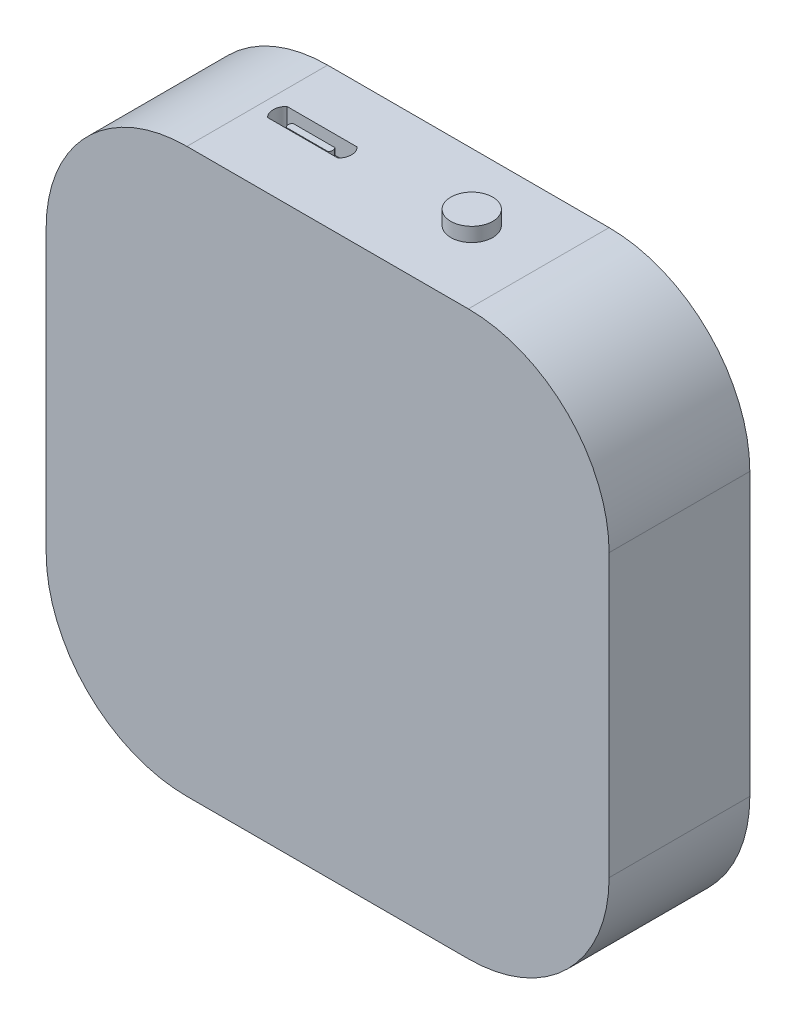
ISO-10303-21;
HEADER;
FILE_DESCRIPTION(('STEP AP214'),'2;1');
FILE_NAME('part.step','',(''),(''),'','','');
FILE_SCHEMA(('AUTOMOTIVE_DESIGN { 1 0 10303 214 1 1 1 1 }'));
ENDSEC;
DATA;
#1=APPLICATION_CONTEXT('core data for automotive mechanical design processes');
#2=APPLICATION_PROTOCOL_DEFINITION('international standard','automotive_design',2000,#1);
#3=PRODUCT_CONTEXT('',#1,'mechanical');
#4=PRODUCT('Part','Part','',(#3));
#5=PRODUCT_RELATED_PRODUCT_CATEGORY('part','',(#4));
#6=PRODUCT_DEFINITION_FORMATION('','',#4);
#7=PRODUCT_DEFINITION_CONTEXT('part definition',#1,'design');
#8=PRODUCT_DEFINITION('design','',#6,#7);
#9=PRODUCT_DEFINITION_SHAPE('','',#8);
#10=(LENGTH_UNIT() NAMED_UNIT(*) SI_UNIT(.MILLI.,.METRE.));
#11=(NAMED_UNIT(*) PLANE_ANGLE_UNIT() SI_UNIT($,.RADIAN.));
#12=(NAMED_UNIT(*) SI_UNIT($,.STERADIAN.) SOLID_ANGLE_UNIT());
#13=UNCERTAINTY_MEASURE_WITH_UNIT(LENGTH_MEASURE(1.E-05),#10,'distance_accuracy_value','');
#14=(GEOMETRIC_REPRESENTATION_CONTEXT(3) GLOBAL_UNCERTAINTY_ASSIGNED_CONTEXT((#13)) GLOBAL_UNIT_ASSIGNED_CONTEXT((#10,
#11,#12)) REPRESENTATION_CONTEXT('',''));
#15=CARTESIAN_POINT('',(0.,0.,0.));
#16=DIRECTION('',(0.,0.,1.));
#17=DIRECTION('',(1.,0.,0.));
#18=AXIS2_PLACEMENT_3D('',#15,#16,#17);
#19=CARTESIAN_POINT('',(3.98835760158891,10.3346153846154,-5.32735397519315));
#20=DIRECTION('',(0.,1.,0.));
#21=DIRECTION('',(0.,0.,1.));
#22=AXIS2_PLACEMENT_3D('',#19,#20,#21);
#23=PLANE('',#22);
#24=CARTESIAN_POINT('',(3.98835760158891,10.3346153846154,-5.32735397519315));
#25=DIRECTION('',(0.,1.,0.));
#26=DIRECTION('',(0.,0.,1.));
#27=AXIS2_PLACEMENT_3D('',#24,#25,#26);
#28=CIRCLE('',#27,0.969111158165627);
#29=CARTESIAN_POINT('',(3.30309252992644,10.3346153846154,-6.01261904685561));
#30=VERTEX_POINT('',#29);
#31=CARTESIAN_POINT('',(3.30309252992644,10.3346153846154,-4.64208890353068));
#32=VERTEX_POINT('',#31);
#33=EDGE_CURVE('E191',#30,#32,#28,.T.);
#34=ORIENTED_EDGE('',*,*,#33,.T.);
#35=DIRECTION('',(1.,0.,0.));
#36=VECTOR('',#35,1.);
#37=CARTESIAN_POINT('',(3.30309252992644,10.3346153846154,-4.64208890353068));
#38=LINE('',#37,#36);
#39=CARTESIAN_POINT('',(8.29889595559474,10.3346153846154,-4.64208890353068));
#40=VERTEX_POINT('',#39);
#41=EDGE_CURVE('E194',#32,#40,#38,.T.);
#42=ORIENTED_EDGE('',*,*,#41,.T.);
#43=CARTESIAN_POINT('',(7.61363088393227,10.3346153846154,-5.32735397519315));
#44=DIRECTION('',(0.,1.,0.));
#45=DIRECTION('',(0.,0.,-1.));
#46=AXIS2_PLACEMENT_3D('',#43,#44,#45);
#47=CIRCLE('',#46,0.969111158165626);
#48=CARTESIAN_POINT('',(8.29889595559474,10.3346153846154,-6.01261904685561));
#49=VERTEX_POINT('',#48);
#50=EDGE_CURVE('E198',#40,#49,#47,.T.);
#51=ORIENTED_EDGE('',*,*,#50,.T.);
#52=DIRECTION('',(-1.,0.,0.));
#53=VECTOR('',#52,1.);
#54=CARTESIAN_POINT('',(3.30309252992644,10.3346153846154,-6.01261904685561));
#55=LINE('',#54,#53);
#56=EDGE_CURVE('E201',#49,#30,#55,.T.);
#57=ORIENTED_EDGE('',*,*,#56,.T.);
#58=EDGE_LOOP('',(#34,#42,#51,#57));
#59=FACE_BOUND('',#58,.T.);
#60=DIRECTION('',(1.,0.,0.));
#61=VECTOR('',#60,1.);
#62=CARTESIAN_POINT('',(4.2757268251893,10.3346153846154,-4.99577410180808));
#63=LINE('',#62,#61);
#64=CARTESIAN_POINT('',(4.2757268251893,10.3346153846154,-4.99577410180808));
#65=VERTEX_POINT('',#64);
#66=CARTESIAN_POINT('',(7.23784036076253,10.3346153846154,-4.99577410180808));
#67=VERTEX_POINT('',#66);
#68=EDGE_CURVE('E659',#65,#67,#63,.T.);
#69=ORIENTED_EDGE('',*,*,#68,.F.);
#70=CARTESIAN_POINT('',(4.51888539900501,10.3346153846154,-5.23893267562379));
#71=DIRECTION('',(0.,1.,0.));
#72=DIRECTION('',(0.,0.,-1.));
#73=AXIS2_PLACEMENT_3D('',#70,#71,#72);
#74=CIRCLE('',#73,0.34387815289748);
#75=CARTESIAN_POINT('',(4.2757268251893,10.3346153846154,-5.4820912494395));
#76=VERTEX_POINT('',#75);
#77=EDGE_CURVE('E183',#76,#65,#74,.T.);
#78=ORIENTED_EDGE('',*,*,#77,.F.);
#79=DIRECTION('',(-1.,0.,0.));
#80=VECTOR('',#79,1.);
#81=CARTESIAN_POINT('',(4.2757268251893,10.3346153846154,-5.4820912494395));
#82=LINE('',#81,#80);
#83=CARTESIAN_POINT('',(7.23784036076253,10.3346153846154,-5.4820912494395));
#84=VERTEX_POINT('',#83);
#85=EDGE_CURVE('E179',#84,#76,#82,.T.);
#86=ORIENTED_EDGE('',*,*,#85,.F.);
#87=CARTESIAN_POINT('',(6.99468178694682,10.3346153846154,-5.23893267562379));
#88=DIRECTION('',(0.,1.,0.));
#89=DIRECTION('',(0.,0.,-1.));
#90=AXIS2_PLACEMENT_3D('',#87,#88,#89);
#91=CIRCLE('',#90,0.343878152897479);
#92=EDGE_CURVE('E657',#67,#84,#91,.T.);
#93=ORIENTED_EDGE('',*,*,#92,.F.);
#94=EDGE_LOOP('',(#69,#78,#86,#93));
#95=FACE_BOUND('',#94,.T.);
#96=ADVANCED_FACE('F42',(#59,#95),#23,.T.);
#97=CARTESIAN_POINT('',(22.2115384615385,-18.3653846153846,-10.));
#98=DIRECTION('',(0.,0.,-1.));
#99=DIRECTION('',(-1.,0.,0.));
#100=AXIS2_PLACEMENT_3D('',#97,#98,#99);
#101=CYLINDRICAL_SURFACE('',#100,10.);
#102=DIRECTION('',(0.,0.,-1.));
#103=VECTOR('',#102,1.);
#104=CARTESIAN_POINT('',(32.2115384615385,-18.3653846153846,-10.));
#105=LINE('',#104,#103);
#106=CARTESIAN_POINT('',(32.2115384615385,-18.3653846153846,0.));
#107=VERTEX_POINT('',#106);
#108=CARTESIAN_POINT('',(32.2115384615385,-18.3653846153846,-10.));
#109=VERTEX_POINT('',#108);
#110=EDGE_CURVE('E292',#107,#109,#105,.T.);
#111=ORIENTED_EDGE('',*,*,#110,.F.);
#112=CARTESIAN_POINT('',(22.2115384615385,-18.3653846153846,0.));
#113=DIRECTION('',(0.,0.,1.));
#114=DIRECTION('',(1.,0.,0.));
#115=AXIS2_PLACEMENT_3D('',#112,#113,#114);
#116=CIRCLE('',#115,10.);
#117=CARTESIAN_POINT('',(22.2115384615385,-28.3653846153846,0.));
#118=VERTEX_POINT('',#117);
#119=EDGE_CURVE('E50',#118,#107,#116,.T.);
#120=ORIENTED_EDGE('',*,*,#119,.F.);
#121=DIRECTION('',(0.,0.,-1.));
#122=VECTOR('',#121,1.);
#123=CARTESIAN_POINT('',(22.2115384615385,-28.3653846153846,-10.));
#124=LINE('',#123,#122);
#125=CARTESIAN_POINT('',(22.2115384615385,-28.3653846153846,-10.));
#126=VERTEX_POINT('',#125);
#127=EDGE_CURVE('E295',#126,#118,#124,.F.);
#128=ORIENTED_EDGE('',*,*,#127,.F.);
#129=CARTESIAN_POINT('',(22.2115384615385,-18.3653846153846,-10.));
#130=DIRECTION('',(0.,0.,1.));
#131=DIRECTION('',(1.,0.,0.));
#132=AXIS2_PLACEMENT_3D('',#129,#130,#131);
#133=CIRCLE('',#132,10.);
#134=EDGE_CURVE('E11',#109,#126,#133,.F.);
#135=ORIENTED_EDGE('',*,*,#134,.F.);
#136=EDGE_LOOP('',(#111,#120,#128,#135));
#137=FACE_BOUND('',#136,.T.);
#138=ADVANCED_FACE('F44',(#137),#101,.T.);
#139=CARTESIAN_POINT('',(2.21153846153849,-18.3653846153846,-10.));
#140=DIRECTION('',(0.,0.,1.));
#141=DIRECTION('',(1.,0.,0.));
#142=AXIS2_PLACEMENT_3D('',#139,#140,#141);
#143=CYLINDRICAL_SURFACE('',#142,10.);
#144=DIRECTION('',(0.,0.,1.));
#145=VECTOR('',#144,1.);
#146=CARTESIAN_POINT('',(-7.78846153846151,-18.3653846153846,-10.));
#147=LINE('',#146,#145);
#148=CARTESIAN_POINT('',(-7.78846153846151,-18.3653846153846,-10.));
#149=VERTEX_POINT('',#148);
#150=CARTESIAN_POINT('',(-7.78846153846151,-18.3653846153846,0.));
#151=VERTEX_POINT('',#150);
#152=EDGE_CURVE('E280',#149,#151,#147,.T.);
#153=ORIENTED_EDGE('',*,*,#152,.F.);
#154=CARTESIAN_POINT('',(2.21153846153849,-18.3653846153846,-10.));
#155=DIRECTION('',(0.,0.,1.));
#156=DIRECTION('',(1.,0.,0.));
#157=AXIS2_PLACEMENT_3D('',#154,#155,#156);
#158=CIRCLE('',#157,10.);
#159=CARTESIAN_POINT('',(2.21153846153849,-28.3653846153846,-10.));
#160=VERTEX_POINT('',#159);
#161=EDGE_CURVE('E288',#160,#149,#158,.F.);
#162=ORIENTED_EDGE('',*,*,#161,.F.);
#163=DIRECTION('',(0.,0.,1.));
#164=VECTOR('',#163,1.);
#165=CARTESIAN_POINT('',(2.21153846153849,-28.3653846153846,-10.));
#166=LINE('',#165,#164);
#167=CARTESIAN_POINT('',(2.21153846153849,-28.3653846153846,0.));
#168=VERTEX_POINT('',#167);
#169=EDGE_CURVE('E285',#168,#160,#166,.F.);
#170=ORIENTED_EDGE('',*,*,#169,.F.);
#171=CARTESIAN_POINT('',(2.21153846153849,-18.3653846153846,0.));
#172=DIRECTION('',(0.,0.,1.));
#173=DIRECTION('',(1.,0.,0.));
#174=AXIS2_PLACEMENT_3D('',#171,#172,#173);
#175=CIRCLE('',#174,10.);
#176=EDGE_CURVE('E290',#151,#168,#175,.T.);
#177=ORIENTED_EDGE('',*,*,#176,.F.);
#178=EDGE_LOOP('',(#153,#162,#170,#177));
#179=FACE_BOUND('',#178,.T.);
#180=ADVANCED_FACE('F327',(#179),#143,.T.);
#181=CARTESIAN_POINT('',(2.21153846153849,1.63461538461538,-10.));
#182=DIRECTION('',(0.,0.,1.));
#183=DIRECTION('',(1.,0.,0.));
#184=AXIS2_PLACEMENT_3D('',#181,#182,#183);
#185=CYLINDRICAL_SURFACE('',#184,10.);
#186=DIRECTION('',(0.,0.,1.));
#187=VECTOR('',#186,1.);
#188=CARTESIAN_POINT('',(2.21153846153849,11.6346153846154,-10.));
#189=LINE('',#188,#187);
#190=CARTESIAN_POINT('',(2.21153846153849,11.6346153846154,-10.));
#191=VERTEX_POINT('',#190);
#192=CARTESIAN_POINT('',(2.21153846153849,11.6346153846154,0.));
#193=VERTEX_POINT('',#192);
#194=EDGE_CURVE('E268',#191,#193,#189,.T.);
#195=ORIENTED_EDGE('',*,*,#194,.F.);
#196=CARTESIAN_POINT('',(2.21153846153849,1.63461538461538,-10.));
#197=DIRECTION('',(0.,0.,1.));
#198=DIRECTION('',(1.,0.,0.));
#199=AXIS2_PLACEMENT_3D('',#196,#197,#198);
#200=CIRCLE('',#199,10.);
#201=CARTESIAN_POINT('',(-7.78846153846151,1.63461538461538,-10.));
#202=VERTEX_POINT('',#201);
#203=EDGE_CURVE('E274',#202,#191,#200,.F.);
#204=ORIENTED_EDGE('',*,*,#203,.F.);
#205=DIRECTION('',(0.,0.,1.));
#206=VECTOR('',#205,1.);
#207=CARTESIAN_POINT('',(-7.78846153846151,1.63461538461538,-10.));
#208=LINE('',#207,#206);
#209=CARTESIAN_POINT('',(-7.78846153846151,1.63461538461538,0.));
#210=VERTEX_POINT('',#209);
#211=EDGE_CURVE('E271',#210,#202,#208,.F.);
#212=ORIENTED_EDGE('',*,*,#211,.F.);
#213=CARTESIAN_POINT('',(2.21153846153849,1.63461538461538,0.));
#214=DIRECTION('',(0.,0.,1.));
#215=DIRECTION('',(1.,0.,0.));
#216=AXIS2_PLACEMENT_3D('',#213,#214,#215);
#217=CIRCLE('',#216,10.);
#218=CARTESIAN_POINT('',(-6.24377605725037,6.97387154894748,0.));
#219=VERTEX_POINT('',#218);
#220=EDGE_CURVE('E276',#219,#210,#217,.T.);
#221=ORIENTED_EDGE('',*,*,#220,.F.);
#222=CARTESIAN_POINT('',(2.21153846153849,1.63461538461538,0.));
#223=DIRECTION('',(0.,0.,1.));
#224=DIRECTION('',(1.,0.,0.));
#225=AXIS2_PLACEMENT_3D('',#222,#223,#224);
#226=CIRCLE('',#225,10.);
#227=CARTESIAN_POINT('',(-3.28697012693114,9.98724391116472,0.));
#228=VERTEX_POINT('',#227);
#229=EDGE_CURVE('E214',#219,#228,#226,.F.);
#230=ORIENTED_EDGE('',*,*,#229,.T.);
#231=CARTESIAN_POINT('',(2.21153846153849,1.63461538461538,0.));
#232=DIRECTION('',(0.,0.,1.));
#233=DIRECTION('',(1.,0.,0.));
#234=AXIS2_PLACEMENT_3D('',#231,#232,#233);
#235=CIRCLE('',#234,10.);
#236=EDGE_CURVE('E278',#193,#228,#235,.T.);
#237=ORIENTED_EDGE('',*,*,#236,.F.);
#238=EDGE_LOOP('',(#195,#204,#212,#221,#230,#237));
#239=FACE_BOUND('',#238,.T.);
#240=ADVANCED_FACE('F319',(#239),#185,.T.);
#241=CARTESIAN_POINT('',(22.2115384615385,1.63461538461538,-10.));
#242=DIRECTION('',(0.,0.,-1.));
#243=DIRECTION('',(-1.,0.,0.));
#244=AXIS2_PLACEMENT_3D('',#241,#242,#243);
#245=CYLINDRICAL_SURFACE('',#244,10.);
#246=DIRECTION('',(0.,0.,-1.));
#247=VECTOR('',#246,1.);
#248=CARTESIAN_POINT('',(22.2115384615385,11.6346153846154,-10.));
#249=LINE('',#248,#247);
#250=CARTESIAN_POINT('',(22.2115384615385,11.6346153846154,0.));
#251=VERTEX_POINT('',#250);
#252=CARTESIAN_POINT('',(22.2115384615385,11.6346153846154,-10.));
#253=VERTEX_POINT('',#252);
#254=EDGE_CURVE('E257',#251,#253,#249,.T.);
#255=ORIENTED_EDGE('',*,*,#254,.F.);
#256=CARTESIAN_POINT('',(22.2115384615385,1.63461538461538,0.));
#257=DIRECTION('',(0.,0.,1.));
#258=DIRECTION('',(1.,0.,0.));
#259=AXIS2_PLACEMENT_3D('',#256,#257,#258);
#260=CIRCLE('',#259,10.);
#261=CARTESIAN_POINT('',(32.2115384615385,1.63461538461538,0.));
#262=VERTEX_POINT('',#261);
#263=EDGE_CURVE('E263',#262,#251,#260,.T.);
#264=ORIENTED_EDGE('',*,*,#263,.F.);
#265=DIRECTION('',(0.,0.,-1.));
#266=VECTOR('',#265,1.);
#267=CARTESIAN_POINT('',(32.2115384615385,1.63461538461538,-10.));
#268=LINE('',#267,#266);
#269=CARTESIAN_POINT('',(32.2115384615385,1.63461538461538,-10.));
#270=VERTEX_POINT('',#269);
#271=EDGE_CURVE('E260',#270,#262,#268,.F.);
#272=ORIENTED_EDGE('',*,*,#271,.F.);
#273=CARTESIAN_POINT('',(22.2115384615385,1.63461538461538,-10.));
#274=DIRECTION('',(0.,0.,1.));
#275=DIRECTION('',(1.,0.,0.));
#276=AXIS2_PLACEMENT_3D('',#273,#274,#275);
#277=CIRCLE('',#276,10.);
#278=EDGE_CURVE('E265',#253,#270,#277,.F.);
#279=ORIENTED_EDGE('',*,*,#278,.F.);
#280=EDGE_LOOP('',(#255,#264,#272,#279));
#281=FACE_BOUND('',#280,.T.);
#282=ADVANCED_FACE('F311',(#281),#245,.T.);
#283=CARTESIAN_POINT('',(-7.78846153846152,11.6346153846154,-10.));
#284=DIRECTION('',(-1.,0.,0.));
#285=DIRECTION('',(0.,-1.,0.));
#286=AXIS2_PLACEMENT_3D('',#283,#284,#285);
#287=PLANE('',#286);
#288=DIRECTION('',(0.,-1.,0.));
#289=VECTOR('',#288,1.);
#290=CARTESIAN_POINT('',(-7.78846153846152,11.6346153846154,-10.));
#291=LINE('',#290,#289);
#292=EDGE_CURVE('E232',#202,#149,#291,.T.);
#293=ORIENTED_EDGE('',*,*,#292,.T.);
#294=ORIENTED_EDGE('',*,*,#152,.T.);
#295=DIRECTION('',(0.,-1.,0.));
#296=VECTOR('',#295,1.);
#297=CARTESIAN_POINT('',(-7.78846153846152,11.6346153846154,0.));
#298=LINE('',#297,#296);
#299=EDGE_CURVE('E223',#210,#151,#298,.T.);
#300=ORIENTED_EDGE('',*,*,#299,.F.);
#301=ORIENTED_EDGE('',*,*,#211,.T.);
#302=EDGE_LOOP('',(#293,#294,#300,#301));
#303=FACE_BOUND('',#302,.T.);
#304=ADVANCED_FACE('F324',(#303),#287,.T.);
#305=CARTESIAN_POINT('',(-7.78846153846152,11.6346153846154,-10.));
#306=DIRECTION('',(0.,1.,0.));
#307=DIRECTION('',(0.,0.,1.));
#308=AXIS2_PLACEMENT_3D('',#305,#306,#307);
#309=PLANE('',#308);
#310=CARTESIAN_POINT('',(17.1987091765573,11.6346153846154,-5.25375548160372));
#311=DIRECTION('',(0.,1.,0.));
#312=DIRECTION('',(0.,0.,1.));
#313=AXIS2_PLACEMENT_3D('',#310,#311,#312);
#314=CIRCLE('',#313,1.49076908591832);
#315=CARTESIAN_POINT('',(17.1987091765573,11.6346153846154,-3.7629863956854));
#316=VERTEX_POINT('',#315);
#317=EDGE_CURVE('E670',#316,#316,#314,.T.);
#318=ORIENTED_EDGE('',*,*,#317,.F.);
#319=EDGE_LOOP('',(#318));
#320=FACE_BOUND('',#319,.T.);
#321=CARTESIAN_POINT('',(3.98835760158891,11.6346153846154,-5.32735397519315));
#322=DIRECTION('',(0.,1.,0.));
#323=DIRECTION('',(0.,0.,1.));
#324=AXIS2_PLACEMENT_3D('',#321,#322,#323);
#325=CIRCLE('',#324,0.969111158165627);
#326=CARTESIAN_POINT('',(3.30309252992644,11.6346153846154,-6.01261904685561));
#327=VERTEX_POINT('',#326);
#328=CARTESIAN_POINT('',(3.30309252992644,11.6346153846154,-4.64208890353068));
#329=VERTEX_POINT('',#328);
#330=EDGE_CURVE('E65',#327,#329,#325,.T.);
#331=ORIENTED_EDGE('',*,*,#330,.F.);
#332=DIRECTION('',(-1.,0.,0.));
#333=VECTOR('',#332,1.);
#334=CARTESIAN_POINT('',(3.30309252992644,11.6346153846154,-6.01261904685561));
#335=LINE('',#334,#333);
#336=CARTESIAN_POINT('',(8.29889595559474,11.6346153846154,-6.01261904685561));
#337=VERTEX_POINT('',#336);
#338=EDGE_CURVE('E195',#337,#327,#335,.T.);
#339=ORIENTED_EDGE('',*,*,#338,.F.);
#340=CARTESIAN_POINT('',(7.61363088393227,11.6346153846154,-5.32735397519315));
#341=DIRECTION('',(0.,1.,0.));
#342=DIRECTION('',(0.,0.,-1.));
#343=AXIS2_PLACEMENT_3D('',#340,#341,#342);
#344=CIRCLE('',#343,0.969111158165626);
#345=CARTESIAN_POINT('',(8.29889595559474,11.6346153846154,-4.64208890353068));
#346=VERTEX_POINT('',#345);
#347=EDGE_CURVE('E207',#346,#337,#344,.T.);
#348=ORIENTED_EDGE('',*,*,#347,.F.);
#349=DIRECTION('',(1.,0.,0.));
#350=VECTOR('',#349,1.);
#351=CARTESIAN_POINT('',(3.30309252992644,11.6346153846154,-4.64208890353068));
#352=LINE('',#351,#350);
#353=EDGE_CURVE('E186',#329,#346,#352,.T.);
#354=ORIENTED_EDGE('',*,*,#353,.F.);
#355=EDGE_LOOP('',(#331,#339,#348,#354));
#356=FACE_BOUND('',#355,.T.);
#357=DIRECTION('',(-1.,0.,0.));
#358=VECTOR('',#357,1.);
#359=CARTESIAN_POINT('',(-7.78846153846152,11.6346153846154,-10.));
#360=LINE('',#359,#358);
#361=EDGE_CURVE('E231',#253,#191,#360,.T.);
#362=ORIENTED_EDGE('',*,*,#361,.T.);
#363=ORIENTED_EDGE('',*,*,#194,.T.);
#364=DIRECTION('',(-1.,0.,0.));
#365=VECTOR('',#364,1.);
#366=CARTESIAN_POINT('',(-7.78846153846152,11.6346153846154,0.));
#367=LINE('',#366,#365);
#368=EDGE_CURVE('E236',#251,#193,#367,.T.);
#369=ORIENTED_EDGE('',*,*,#368,.F.);
#370=ORIENTED_EDGE('',*,*,#254,.T.);
#371=EDGE_LOOP('',(#362,#363,#369,#370));
#372=FACE_BOUND('',#371,.T.);
#373=ADVANCED_FACE('F315',(#320,#356,#372),#309,.T.);
#374=CARTESIAN_POINT('',(32.2115384615385,11.6346153846154,-10.));
#375=DIRECTION('',(1.,0.,0.));
#376=DIRECTION('',(0.,0.,-1.));
#377=AXIS2_PLACEMENT_3D('',#374,#375,#376);
#378=PLANE('',#377);
#379=DIRECTION('',(0.,1.,0.));
#380=VECTOR('',#379,1.);
#381=CARTESIAN_POINT('',(32.2115384615385,11.6346153846154,0.));
#382=LINE('',#381,#380);
#383=EDGE_CURVE('E248',#107,#262,#382,.T.);
#384=ORIENTED_EDGE('',*,*,#383,.F.);
#385=ORIENTED_EDGE('',*,*,#110,.T.);
#386=DIRECTION('',(0.,1.,0.));
#387=VECTOR('',#386,1.);
#388=CARTESIAN_POINT('',(32.2115384615385,11.6346153846154,-10.));
#389=LINE('',#388,#387);
#390=EDGE_CURVE('E239',#109,#270,#389,.T.);
#391=ORIENTED_EDGE('',*,*,#390,.T.);
#392=ORIENTED_EDGE('',*,*,#271,.T.);
#393=EDGE_LOOP('',(#384,#385,#391,#392));
#394=FACE_BOUND('',#393,.T.);
#395=ADVANCED_FACE('F307',(#394),#378,.T.);
#396=CARTESIAN_POINT('',(-7.78846153846151,-28.3653846153846,-10.));
#397=DIRECTION('',(0.,-1.,0.));
#398=DIRECTION('',(1.,0.,0.));
#399=AXIS2_PLACEMENT_3D('',#396,#397,#398);
#400=PLANE('',#399);
#401=DIRECTION('',(1.,0.,0.));
#402=VECTOR('',#401,1.);
#403=CARTESIAN_POINT('',(-7.78846153846151,-28.3653846153846,-10.));
#404=LINE('',#403,#402);
#405=EDGE_CURVE('E235',#160,#126,#404,.T.);
#406=ORIENTED_EDGE('',*,*,#405,.T.);
#407=ORIENTED_EDGE('',*,*,#127,.T.);
#408=DIRECTION('',(1.,0.,0.));
#409=VECTOR('',#408,1.);
#410=CARTESIAN_POINT('',(-7.78846153846151,-28.3653846153846,0.));
#411=LINE('',#410,#409);
#412=EDGE_CURVE('E245',#168,#118,#411,.T.);
#413=ORIENTED_EDGE('',*,*,#412,.F.);
#414=ORIENTED_EDGE('',*,*,#169,.T.);
#415=EDGE_LOOP('',(#406,#407,#413,#414));
#416=FACE_BOUND('',#415,.T.);
#417=ADVANCED_FACE('F331',(#416),#400,.T.);
#418=CARTESIAN_POINT('',(0.,0.,-10.));
#419=DIRECTION('',(0.,0.,1.));
#420=DIRECTION('',(1.,0.,0.));
#421=AXIS2_PLACEMENT_3D('',#418,#419,#420);
#422=PLANE('',#421);
#423=CARTESIAN_POINT('',(12.2115384615385,-8.36538461538462,-10.));
#424=DIRECTION('',(0.,0.,-1.));
#425=DIRECTION('',(-1.,0.,0.));
#426=AXIS2_PLACEMENT_3D('',#423,#424,#425);
#427=CIRCLE('',#426,12.5);
#428=CARTESIAN_POINT('',(-0.288461538461515,-8.36538461538462,-10.));
#429=VERTEX_POINT('',#428);
#430=EDGE_CURVE('E227',#429,#429,#427,.T.);
#431=ORIENTED_EDGE('',*,*,#430,.F.);
#432=EDGE_LOOP('',(#431));
#433=FACE_BOUND('',#432,.T.);
#434=ORIENTED_EDGE('',*,*,#390,.F.);
#435=ORIENTED_EDGE('',*,*,#134,.T.);
#436=ORIENTED_EDGE('',*,*,#405,.F.);
#437=ORIENTED_EDGE('',*,*,#161,.T.);
#438=ORIENTED_EDGE('',*,*,#292,.F.);
#439=ORIENTED_EDGE('',*,*,#203,.T.);
#440=ORIENTED_EDGE('',*,*,#361,.F.);
#441=ORIENTED_EDGE('',*,*,#278,.T.);
#442=EDGE_LOOP('',(#434,#435,#436,#437,#438,#439,#440,#441));
#443=FACE_BOUND('',#442,.T.);
#444=ADVANCED_FACE('F333',(#433,#443),#422,.F.);
#445=CARTESIAN_POINT('',(0.,0.,0.));
#446=DIRECTION('',(0.,0.,1.));
#447=DIRECTION('',(1.,0.,0.));
#448=AXIS2_PLACEMENT_3D('',#445,#446,#447);
#449=PLANE('',#448);
#450=ORIENTED_EDGE('',*,*,#412,.T.);
#451=ORIENTED_EDGE('',*,*,#119,.T.);
#452=ORIENTED_EDGE('',*,*,#383,.T.);
#453=ORIENTED_EDGE('',*,*,#263,.T.);
#454=ORIENTED_EDGE('',*,*,#368,.T.);
#455=ORIENTED_EDGE('',*,*,#236,.T.);
#456=ORIENTED_EDGE('',*,*,#229,.F.);
#457=ORIENTED_EDGE('',*,*,#220,.T.);
#458=ORIENTED_EDGE('',*,*,#299,.T.);
#459=ORIENTED_EDGE('',*,*,#176,.T.);
#460=EDGE_LOOP('',(#450,#451,#452,#453,#454,#455,#456,#457,#458,#459));
#461=FACE_BOUND('',#460,.T.);
#462=ADVANCED_FACE('F299',(#461),#449,.T.);
#463=CARTESIAN_POINT('',(12.2115384615385,-8.36538461538462,-21.));
#464=DIRECTION('',(0.,0.,1.));
#465=DIRECTION('',(1.,0.,0.));
#466=AXIS2_PLACEMENT_3D('',#463,#464,#465);
#467=CYLINDRICAL_SURFACE('',#466,12.5);
#468=CARTESIAN_POINT('',(12.2115384615385,-8.36538461538462,-17.));
#469=DIRECTION('',(0.,0.,-1.));
#470=DIRECTION('',(-1.,0.,0.));
#471=AXIS2_PLACEMENT_3D('',#468,#469,#470);
#472=CIRCLE('',#471,12.5);
#473=CARTESIAN_POINT('',(-0.288461538461515,-8.36538461538462,-17.));
#474=VERTEX_POINT('',#473);
#475=EDGE_CURVE('E254',#474,#474,#472,.F.);
#476=ORIENTED_EDGE('',*,*,#475,.T.);
#477=EDGE_LOOP('',(#476));
#478=FACE_BOUND('',#477,.T.);
#479=ORIENTED_EDGE('',*,*,#430,.T.);
#480=EDGE_LOOP('',(#479));
#481=FACE_BOUND('',#480,.T.);
#482=ADVANCED_FACE('F341',(#478,#481),#467,.T.);
#483=CARTESIAN_POINT('',(12.2115384615385,-8.36538461538462,-21.));
#484=DIRECTION('',(0.,0.,-1.));
#485=DIRECTION('',(-1.,0.,0.));
#486=AXIS2_PLACEMENT_3D('',#483,#484,#485);
#487=PLANE('',#486);
#488=CARTESIAN_POINT('',(12.1267722128187,-8.56317252906399,-21.));
#489=DIRECTION('',(0.,0.,-1.));
#490=DIRECTION('',(-1.,0.,0.));
#491=AXIS2_PLACEMENT_3D('',#488,#489,#490);
#492=CIRCLE('',#491,4.);
#493=CARTESIAN_POINT('',(8.12677221281871,-8.56317252906399,-21.));
#494=VERTEX_POINT('',#493);
#495=EDGE_CURVE('E224',#494,#494,#492,.T.);
#496=ORIENTED_EDGE('',*,*,#495,.F.);
#497=EDGE_LOOP('',(#496));
#498=FACE_BOUND('',#497,.T.);
#499=CARTESIAN_POINT('',(12.2115384615385,-8.36538461538462,-21.));
#500=DIRECTION('',(0.,0.,-1.));
#501=DIRECTION('',(-1.,0.,0.));
#502=AXIS2_PLACEMENT_3D('',#499,#500,#501);
#503=CIRCLE('',#502,8.50000000000001);
#504=CARTESIAN_POINT('',(3.71153846153847,-8.36538461538462,-21.));
#505=VERTEX_POINT('',#504);
#506=EDGE_CURVE('E230',#505,#505,#503,.T.);
#507=ORIENTED_EDGE('',*,*,#506,.T.);
#508=EDGE_LOOP('',(#507));
#509=FACE_BOUND('',#508,.T.);
#510=ADVANCED_FACE('F380',(#498,#509),#487,.T.);
#511=CARTESIAN_POINT('',(12.2115384615385,-8.36538461538462,-21.));
#512=DIRECTION('',(0.,0.,1.));
#513=DIRECTION('',(1.,0.,0.));
#514=AXIS2_PLACEMENT_3D('',#511,#512,#513);
#515=CONICAL_SURFACE('',#514,8.50000000000001,0.785398163397447);
#516=ORIENTED_EDGE('',*,*,#475,.F.);
#517=EDGE_LOOP('',(#516));
#518=FACE_BOUND('',#517,.T.);
#519=ORIENTED_EDGE('',*,*,#506,.F.);
#520=EDGE_LOOP('',(#519));
#521=FACE_BOUND('',#520,.T.);
#522=ADVANCED_FACE('F378',(#518,#521),#515,.T.);
#523=CARTESIAN_POINT('',(12.1267722128187,-8.56317252906399,-20.));
#524=DIRECTION('',(0.,0.,-1.));
#525=DIRECTION('',(-1.,0.,0.));
#526=AXIS2_PLACEMENT_3D('',#523,#524,#525);
#527=CYLINDRICAL_SURFACE('',#526,4.);
#528=CARTESIAN_POINT('',(12.1267722128187,-8.56317252906399,-20.));
#529=DIRECTION('',(0.,0.,-1.));
#530=DIRECTION('',(-1.,0.,0.));
#531=AXIS2_PLACEMENT_3D('',#528,#529,#530);
#532=CIRCLE('',#531,4.);
#533=CARTESIAN_POINT('',(8.12677221281871,-8.56317252906399,-20.));
#534=VERTEX_POINT('',#533);
#535=EDGE_CURVE('E220',#534,#534,#532,.T.);
#536=ORIENTED_EDGE('',*,*,#535,.F.);
#537=EDGE_LOOP('',(#536));
#538=FACE_BOUND('',#537,.T.);
#539=ORIENTED_EDGE('',*,*,#495,.T.);
#540=EDGE_LOOP('',(#539));
#541=FACE_BOUND('',#540,.T.);
#542=ADVANCED_FACE('F374',(#538,#541),#527,.F.);
#543=CARTESIAN_POINT('',(12.1267722128187,-8.56317252906399,-20.));
#544=DIRECTION('',(0.,0.,-1.));
#545=DIRECTION('',(-1.,0.,0.));
#546=AXIS2_PLACEMENT_3D('',#543,#544,#545);
#547=PLANE('',#546);
#548=CARTESIAN_POINT('',(12.1267722128187,-8.56317252906399,-20.));
#549=DIRECTION('',(0.,0.,-1.));
#550=DIRECTION('',(-1.,0.,0.));
#551=AXIS2_PLACEMENT_3D('',#548,#549,#550);
#552=CIRCLE('',#551,1.31848668776102);
#553=CARTESIAN_POINT('',(10.8082855250577,-8.56317252906399,-20.));
#554=VERTEX_POINT('',#553);
#555=EDGE_CURVE('E677',#554,#554,#552,.T.);
#556=ORIENTED_EDGE('',*,*,#555,.F.);
#557=EDGE_LOOP('',(#556));
#558=FACE_BOUND('',#557,.T.);
#559=ORIENTED_EDGE('',*,*,#535,.T.);
#560=EDGE_LOOP('',(#559));
#561=FACE_BOUND('',#560,.T.);
#562=ADVANCED_FACE('F371',(#558,#561),#547,.T.);
#563=CARTESIAN_POINT('',(3.98835760158891,10.3346153846154,-5.32735397519315));
#564=DIRECTION('',(0.,1.,0.));
#565=DIRECTION('',(0.,0.,1.));
#566=AXIS2_PLACEMENT_3D('',#563,#564,#565);
#567=CYLINDRICAL_SURFACE('',#566,0.969111158165627);
#568=ORIENTED_EDGE('',*,*,#330,.T.);
#569=DIRECTION('',(0.,1.,0.));
#570=VECTOR('',#569,1.);
#571=CARTESIAN_POINT('',(3.30309252992644,10.3346153846154,-4.64208890353068));
#572=LINE('',#571,#570);
#573=EDGE_CURVE('E203',#32,#329,#572,.T.);
#574=ORIENTED_EDGE('',*,*,#573,.F.);
#575=ORIENTED_EDGE('',*,*,#33,.F.);
#576=DIRECTION('',(0.,1.,0.));
#577=VECTOR('',#576,1.);
#578=CARTESIAN_POINT('',(3.30309252992644,10.3346153846154,-6.01261904685561));
#579=LINE('',#578,#577);
#580=EDGE_CURVE('E212',#30,#327,#579,.T.);
#581=ORIENTED_EDGE('',*,*,#580,.T.);
#582=EDGE_LOOP('',(#568,#574,#575,#581));
#583=FACE_BOUND('',#582,.T.);
#584=ADVANCED_FACE('F360',(#583),#567,.F.);
#585=CARTESIAN_POINT('',(3.30309252992644,10.3346153846154,-6.01261904685561));
#586=DIRECTION('',(0.,0.,-1.));
#587=DIRECTION('',(-1.,0.,0.));
#588=AXIS2_PLACEMENT_3D('',#585,#586,#587);
#589=PLANE('',#588);
#590=ORIENTED_EDGE('',*,*,#338,.T.);
#591=ORIENTED_EDGE('',*,*,#580,.F.);
#592=ORIENTED_EDGE('',*,*,#56,.F.);
#593=DIRECTION('',(0.,1.,0.));
#594=VECTOR('',#593,1.);
#595=CARTESIAN_POINT('',(8.29889595559474,10.3346153846154,-6.01261904685561));
#596=LINE('',#595,#594);
#597=EDGE_CURVE('E215',#49,#337,#596,.T.);
#598=ORIENTED_EDGE('',*,*,#597,.T.);
#599=EDGE_LOOP('',(#590,#591,#592,#598));
#600=FACE_BOUND('',#599,.T.);
#601=ADVANCED_FACE('F356',(#600),#589,.F.);
#602=CARTESIAN_POINT('',(7.61363088393227,10.3346153846154,-5.32735397519315));
#603=DIRECTION('',(0.,1.,0.));
#604=DIRECTION('',(0.,0.,1.));
#605=AXIS2_PLACEMENT_3D('',#602,#603,#604);
#606=CYLINDRICAL_SURFACE('',#605,0.969111158165626);
#607=ORIENTED_EDGE('',*,*,#347,.T.);
#608=ORIENTED_EDGE('',*,*,#597,.F.);
#609=ORIENTED_EDGE('',*,*,#50,.F.);
#610=DIRECTION('',(0.,1.,0.));
#611=VECTOR('',#610,1.);
#612=CARTESIAN_POINT('',(8.29889595559474,10.3346153846154,-4.64208890353068));
#613=LINE('',#612,#611);
#614=EDGE_CURVE('E217',#40,#346,#613,.T.);
#615=ORIENTED_EDGE('',*,*,#614,.T.);
#616=EDGE_LOOP('',(#607,#608,#609,#615));
#617=FACE_BOUND('',#616,.T.);
#618=ADVANCED_FACE('F359',(#617),#606,.F.);
#619=CARTESIAN_POINT('',(3.30309252992644,10.3346153846154,-4.64208890353068));
#620=DIRECTION('',(0.,0.,1.));
#621=DIRECTION('',(1.,0.,0.));
#622=AXIS2_PLACEMENT_3D('',#619,#620,#621);
#623=PLANE('',#622);
#624=ORIENTED_EDGE('',*,*,#353,.T.);
#625=ORIENTED_EDGE('',*,*,#614,.F.);
#626=ORIENTED_EDGE('',*,*,#41,.F.);
#627=ORIENTED_EDGE('',*,*,#573,.T.);
#628=EDGE_LOOP('',(#624,#625,#626,#627));
#629=FACE_BOUND('',#628,.T.);
#630=ADVANCED_FACE('F364',(#629),#623,.F.);
#631=CARTESIAN_POINT('',(4.51888539900501,11.3346153846154,-5.23893267562379));
#632=DIRECTION('',(0.,-1.,0.));
#633=DIRECTION('',(0.,0.,-1.));
#634=AXIS2_PLACEMENT_3D('',#631,#632,#633);
#635=CYLINDRICAL_SURFACE('',#634,0.34387815289748);
#636=ORIENTED_EDGE('',*,*,#77,.T.);
#637=DIRECTION('',(0.,-1.,0.));
#638=VECTOR('',#637,1.);
#639=CARTESIAN_POINT('',(4.2757268251893,11.3346153846154,-4.99577410180808));
#640=LINE('',#639,#638);
#641=CARTESIAN_POINT('',(4.2757268251893,11.3346153846154,-4.99577410180808));
#642=VERTEX_POINT('',#641);
#643=EDGE_CURVE('E164',#642,#65,#640,.T.);
#644=ORIENTED_EDGE('',*,*,#643,.F.);
#645=CARTESIAN_POINT('',(4.51888539900501,11.3346153846154,-5.23893267562379));
#646=DIRECTION('',(0.,1.,0.));
#647=DIRECTION('',(0.,0.,-1.));
#648=AXIS2_PLACEMENT_3D('',#645,#646,#647);
#649=CIRCLE('',#648,0.34387815289748);
#650=CARTESIAN_POINT('',(4.2757268251893,11.3346153846154,-5.4820912494395));
#651=VERTEX_POINT('',#650);
#652=EDGE_CURVE('E171',#651,#642,#649,.T.);
#653=ORIENTED_EDGE('',*,*,#652,.F.);
#654=DIRECTION('',(0.,-1.,0.));
#655=VECTOR('',#654,1.);
#656=CARTESIAN_POINT('',(4.2757268251893,11.3346153846154,-5.4820912494395));
#657=LINE('',#656,#655);
#658=EDGE_CURVE('E664',#651,#76,#657,.T.);
#659=ORIENTED_EDGE('',*,*,#658,.T.);
#660=EDGE_LOOP('',(#636,#644,#653,#659));
#661=FACE_BOUND('',#660,.T.);
#662=ADVANCED_FACE('F181',(#661),#635,.T.);
#663=CARTESIAN_POINT('',(4.2757268251893,11.3346153846154,-4.99577410180808));
#664=DIRECTION('',(0.,0.,-1.));
#665=DIRECTION('',(-1.,0.,0.));
#666=AXIS2_PLACEMENT_3D('',#663,#664,#665);
#667=PLANE('',#666);
#668=ORIENTED_EDGE('',*,*,#68,.T.);
#669=DIRECTION('',(0.,-1.,0.));
#670=VECTOR('',#669,1.);
#671=CARTESIAN_POINT('',(7.23784036076253,11.3346153846154,-4.99577410180808));
#672=LINE('',#671,#670);
#673=CARTESIAN_POINT('',(7.23784036076253,11.3346153846154,-4.99577410180808));
#674=VERTEX_POINT('',#673);
#675=EDGE_CURVE('E167',#674,#67,#672,.T.);
#676=ORIENTED_EDGE('',*,*,#675,.F.);
#677=DIRECTION('',(1.,0.,0.));
#678=VECTOR('',#677,1.);
#679=CARTESIAN_POINT('',(4.2757268251893,11.3346153846154,-4.99577410180808));
#680=LINE('',#679,#678);
#681=EDGE_CURVE('E160',#642,#674,#680,.T.);
#682=ORIENTED_EDGE('',*,*,#681,.F.);
#683=ORIENTED_EDGE('',*,*,#643,.T.);
#684=EDGE_LOOP('',(#668,#676,#682,#683));
#685=FACE_BOUND('',#684,.T.);
#686=ADVANCED_FACE('F162',(#685),#667,.F.);
#687=CARTESIAN_POINT('',(6.99468178694682,11.3346153846154,-5.23893267562379));
#688=DIRECTION('',(0.,-1.,0.));
#689=DIRECTION('',(0.,0.,-1.));
#690=AXIS2_PLACEMENT_3D('',#687,#688,#689);
#691=CYLINDRICAL_SURFACE('',#690,0.343878152897479);
#692=ORIENTED_EDGE('',*,*,#92,.T.);
#693=DIRECTION('',(0.,-1.,0.));
#694=VECTOR('',#693,1.);
#695=CARTESIAN_POINT('',(7.23784036076253,11.3346153846154,-5.4820912494395));
#696=LINE('',#695,#694);
#697=CARTESIAN_POINT('',(7.23784036076253,11.3346153846154,-5.4820912494395));
#698=VERTEX_POINT('',#697);
#699=EDGE_CURVE('E57',#698,#84,#696,.T.);
#700=ORIENTED_EDGE('',*,*,#699,.F.);
#701=CARTESIAN_POINT('',(6.99468178694682,11.3346153846154,-5.23893267562379));
#702=DIRECTION('',(0.,1.,0.));
#703=DIRECTION('',(0.,0.,-1.));
#704=AXIS2_PLACEMENT_3D('',#701,#702,#703);
#705=CIRCLE('',#704,0.343878152897479);
#706=EDGE_CURVE('E170',#674,#698,#705,.T.);
#707=ORIENTED_EDGE('',*,*,#706,.F.);
#708=ORIENTED_EDGE('',*,*,#675,.T.);
#709=EDGE_LOOP('',(#692,#700,#707,#708));
#710=FACE_BOUND('',#709,.T.);
#711=ADVANCED_FACE('F567',(#710),#691,.T.);
#712=CARTESIAN_POINT('',(4.2757268251893,11.3346153846154,-5.4820912494395));
#713=DIRECTION('',(0.,0.,1.));
#714=DIRECTION('',(1.,0.,0.));
#715=AXIS2_PLACEMENT_3D('',#712,#713,#714);
#716=PLANE('',#715);
#717=ORIENTED_EDGE('',*,*,#85,.T.);
#718=ORIENTED_EDGE('',*,*,#658,.F.);
#719=DIRECTION('',(-1.,0.,0.));
#720=VECTOR('',#719,1.);
#721=CARTESIAN_POINT('',(4.2757268251893,11.3346153846154,-5.4820912494395));
#722=LINE('',#721,#720);
#723=EDGE_CURVE('E175',#698,#651,#722,.T.);
#724=ORIENTED_EDGE('',*,*,#723,.F.);
#725=ORIENTED_EDGE('',*,*,#699,.T.);
#726=EDGE_LOOP('',(#717,#718,#724,#725));
#727=FACE_BOUND('',#726,.T.);
#728=ADVANCED_FACE('F559',(#727),#716,.F.);
#729=CARTESIAN_POINT('',(4.51888539900501,11.3346153846154,-5.23893267562379));
#730=DIRECTION('',(0.,-1.,0.));
#731=DIRECTION('',(0.,0.,-1.));
#732=AXIS2_PLACEMENT_3D('',#729,#730,#731);
#733=PLANE('',#732);
#734=ORIENTED_EDGE('',*,*,#652,.T.);
#735=ORIENTED_EDGE('',*,*,#681,.T.);
#736=ORIENTED_EDGE('',*,*,#706,.T.);
#737=ORIENTED_EDGE('',*,*,#723,.T.);
#738=EDGE_LOOP('',(#734,#735,#736,#737));
#739=FACE_BOUND('',#738,.T.);
#740=ADVANCED_FACE('F174',(#739),#733,.F.);
#741=CARTESIAN_POINT('',(17.1987091765573,12.6346153846154,-5.25375548160372));
#742=DIRECTION('',(0.,-1.,0.));
#743=DIRECTION('',(0.,0.,-1.));
#744=AXIS2_PLACEMENT_3D('',#741,#742,#743);
#745=CYLINDRICAL_SURFACE('',#744,1.49076908591832);
#746=CARTESIAN_POINT('',(17.1987091765573,12.6346153846154,-5.25375548160372));
#747=DIRECTION('',(0.,1.,0.));
#748=DIRECTION('',(0.,0.,1.));
#749=AXIS2_PLACEMENT_3D('',#746,#747,#748);
#750=CIRCLE('',#749,1.49076908591832);
#751=CARTESIAN_POINT('',(17.1987091765573,12.6346153846154,-3.7629863956854));
#752=VERTEX_POINT('',#751);
#753=EDGE_CURVE('E668',#752,#752,#750,.T.);
#754=ORIENTED_EDGE('',*,*,#753,.F.);
#755=EDGE_LOOP('',(#754));
#756=FACE_BOUND('',#755,.T.);
#757=ORIENTED_EDGE('',*,*,#317,.T.);
#758=EDGE_LOOP('',(#757));
#759=FACE_BOUND('',#758,.T.);
#760=ADVANCED_FACE('F546',(#756,#759),#745,.T.);
#761=CARTESIAN_POINT('',(17.1987091765573,12.6346153846154,-5.25375548160372));
#762=DIRECTION('',(0.,1.,0.));
#763=DIRECTION('',(0.,0.,1.));
#764=AXIS2_PLACEMENT_3D('',#761,#762,#763);
#765=PLANE('',#764);
#766=ORIENTED_EDGE('',*,*,#753,.T.);
#767=EDGE_LOOP('',(#766));
#768=FACE_BOUND('',#767,.T.);
#769=ADVANCED_FACE('F517',(#768),#765,.T.);
#770=CARTESIAN_POINT('',(12.1267722128187,-8.56317252906399,-19.));
#771=DIRECTION('',(0.,0.,-1.));
#772=DIRECTION('',(-1.,0.,0.));
#773=AXIS2_PLACEMENT_3D('',#770,#771,#772);
#774=CYLINDRICAL_SURFACE('',#773,1.31848668776102);
#775=CARTESIAN_POINT('',(12.1267722128187,-8.56317252906399,-19.));
#776=DIRECTION('',(0.,0.,-1.));
#777=DIRECTION('',(-1.,0.,0.));
#778=AXIS2_PLACEMENT_3D('',#775,#776,#777);
#779=CIRCLE('',#778,1.31848668776102);
#780=CARTESIAN_POINT('',(10.8082855250577,-8.56317252906399,-19.));
#781=VERTEX_POINT('',#780);
#782=EDGE_CURVE('E674',#781,#781,#779,.T.);
#783=ORIENTED_EDGE('',*,*,#782,.F.);
#784=EDGE_LOOP('',(#783));
#785=FACE_BOUND('',#784,.T.);
#786=ORIENTED_EDGE('',*,*,#555,.T.);
#787=EDGE_LOOP('',(#786));
#788=FACE_BOUND('',#787,.T.);
#789=ADVANCED_FACE('F522',(#785,#788),#774,.F.);
#790=CARTESIAN_POINT('',(12.1267722128187,-8.56317252906399,-19.));
#791=DIRECTION('',(0.,0.,-1.));
#792=DIRECTION('',(-1.,0.,0.));
#793=AXIS2_PLACEMENT_3D('',#790,#791,#792);
#794=PLANE('',#793);
#795=ORIENTED_EDGE('',*,*,#782,.T.);
#796=EDGE_LOOP('',(#795));
#797=FACE_BOUND('',#796,.T.);
#798=ADVANCED_FACE('F527',(#797),#794,.T.);
#799=CLOSED_SHELL('',(#96,#138,#180,#240,#282,#304,#373,#395,#417,#444,#462,#482,#510,#522,#542,
#562,#584,#601,#618,#630,#662,#686,#711,#728,#740,#760,#769,#789,#798));
#800=MANIFOLD_SOLID_BREP('B2',#799);
#801=ADVANCED_BREP_SHAPE_REPRESENTATION('',(#18,#800),#14);
#802=SHAPE_DEFINITION_REPRESENTATION(#9,#801);
ENDSEC;
END-ISO-10303-21;
